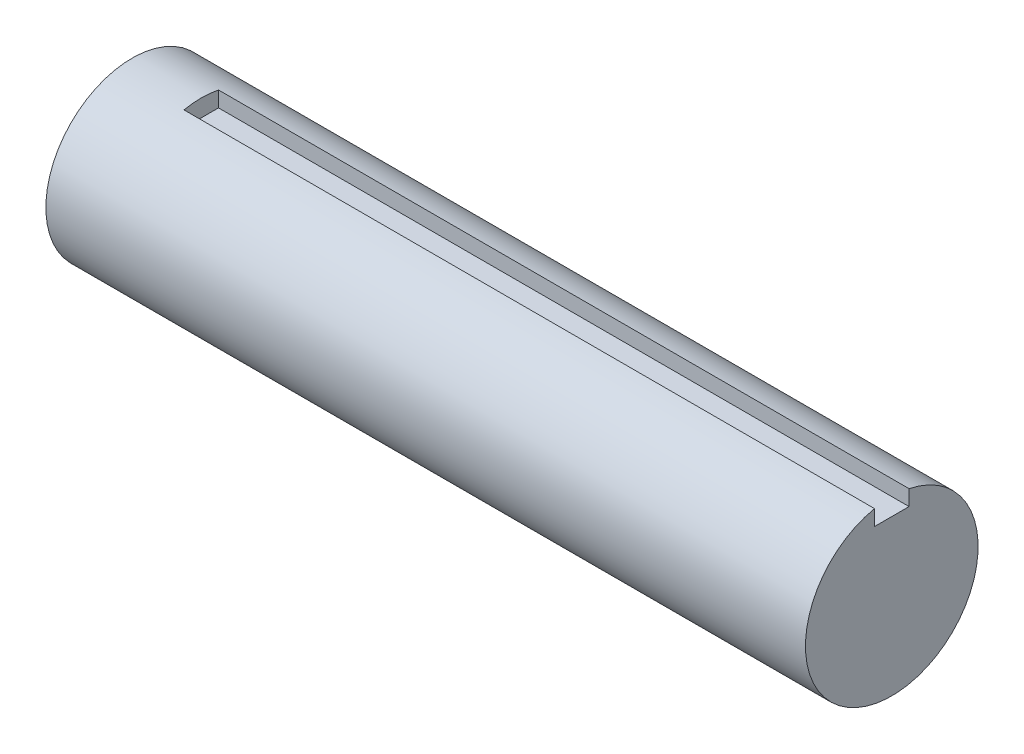
ISO-10303-21;
HEADER;
FILE_DESCRIPTION(('STEP AP214'),'2;1');
FILE_NAME('part.step','',(''),(''),'','','');
FILE_SCHEMA(('AUTOMOTIVE_DESIGN { 1 0 10303 214 1 1 1 1 }'));
ENDSEC;
DATA;
#1=APPLICATION_CONTEXT('core data for automotive mechanical design processes');
#2=APPLICATION_PROTOCOL_DEFINITION('international standard','automotive_design',2000,#1);
#3=PRODUCT_CONTEXT('',#1,'mechanical');
#4=PRODUCT('Part','Part','',(#3));
#5=PRODUCT_RELATED_PRODUCT_CATEGORY('part','',(#4));
#6=PRODUCT_DEFINITION_FORMATION('','',#4);
#7=PRODUCT_DEFINITION_CONTEXT('part definition',#1,'design');
#8=PRODUCT_DEFINITION('design','',#6,#7);
#9=PRODUCT_DEFINITION_SHAPE('','',#8);
#10=(LENGTH_UNIT() NAMED_UNIT(*) SI_UNIT(.MILLI.,.METRE.));
#11=(NAMED_UNIT(*) PLANE_ANGLE_UNIT() SI_UNIT($,.RADIAN.));
#12=(NAMED_UNIT(*) SI_UNIT($,.STERADIAN.) SOLID_ANGLE_UNIT());
#13=UNCERTAINTY_MEASURE_WITH_UNIT(LENGTH_MEASURE(1.E-05),#10,'distance_accuracy_value','');
#14=(GEOMETRIC_REPRESENTATION_CONTEXT(3) GLOBAL_UNCERTAINTY_ASSIGNED_CONTEXT((#13)) GLOBAL_UNIT_ASSIGNED_CONTEXT((#10,
#11,#12)) REPRESENTATION_CONTEXT('',''));
#15=CARTESIAN_POINT('',(0.,0.,0.));
#16=DIRECTION('',(0.,0.,1.));
#17=DIRECTION('',(1.,0.,0.));
#18=AXIS2_PLACEMENT_3D('',#15,#16,#17);
#19=CARTESIAN_POINT('',(335.28,0.,0.));
#20=DIRECTION('',(-1.,0.,0.));
#21=DIRECTION('',(0.,0.,1.));
#22=AXIS2_PLACEMENT_3D('',#19,#20,#21);
#23=CYLINDRICAL_SURFACE('',#22,38.1);
#24=CARTESIAN_POINT('',(30.48,0.,0.));
#25=DIRECTION('',(-1.,0.,0.));
#26=DIRECTION('',(0.,0.,1.));
#27=AXIS2_PLACEMENT_3D('',#24,#25,#26);
#28=CIRCLE('',#27,38.1);
#29=CARTESIAN_POINT('',(30.48,37.3302236800156,7.62));
#30=VERTEX_POINT('',#29);
#31=CARTESIAN_POINT('',(30.48,37.3302236800156,-7.62));
#32=VERTEX_POINT('',#31);
#33=EDGE_CURVE('E11',#30,#32,#28,.T.);
#34=ORIENTED_EDGE('',*,*,#33,.T.);
#35=DIRECTION('',(-1.,0.,0.));
#36=VECTOR('',#35,1.);
#37=CARTESIAN_POINT('',(335.28,37.3302236800156,-7.62));
#38=LINE('',#37,#36);
#39=CARTESIAN_POINT('',(335.28,37.3302236800156,-7.62));
#40=VERTEX_POINT('',#39);
#41=EDGE_CURVE('E55',#32,#40,#38,.F.);
#42=ORIENTED_EDGE('',*,*,#41,.T.);
#43=CARTESIAN_POINT('',(335.28,0.,0.));
#44=DIRECTION('',(1.,0.,0.));
#45=DIRECTION('',(0.,0.,-1.));
#46=AXIS2_PLACEMENT_3D('',#43,#44,#45);
#47=CIRCLE('',#46,38.1);
#48=CARTESIAN_POINT('',(335.28,37.3302236800156,7.62));
#49=VERTEX_POINT('',#48);
#50=EDGE_CURVE('E101',#49,#40,#47,.T.);
#51=ORIENTED_EDGE('',*,*,#50,.F.);
#52=DIRECTION('',(-1.,0.,0.));
#53=VECTOR('',#52,1.);
#54=CARTESIAN_POINT('',(335.28,37.3302236800156,7.62));
#55=LINE('',#54,#53);
#56=EDGE_CURVE('E47',#49,#30,#55,.T.);
#57=ORIENTED_EDGE('',*,*,#56,.T.);
#58=EDGE_LOOP('',(#34,#42,#51,#57));
#59=FACE_BOUND('',#58,.T.);
#60=CARTESIAN_POINT('',(0.,0.,0.));
#61=DIRECTION('',(1.,0.,0.));
#62=DIRECTION('',(0.,0.,-1.));
#63=AXIS2_PLACEMENT_3D('',#60,#61,#62);
#64=CIRCLE('',#63,38.1);
#65=CARTESIAN_POINT('',(0.,0.,-38.1));
#66=VERTEX_POINT('',#65);
#67=EDGE_CURVE('E100',#66,#66,#64,.T.);
#68=ORIENTED_EDGE('',*,*,#67,.T.);
#69=EDGE_LOOP('',(#68));
#70=FACE_BOUND('',#69,.T.);
#71=ADVANCED_FACE('F33',(#59,#70),#23,.T.);
#72=CARTESIAN_POINT('',(335.28,0.,0.));
#73=DIRECTION('',(1.,0.,0.));
#74=DIRECTION('',(0.,0.,-1.));
#75=AXIS2_PLACEMENT_3D('',#72,#73,#74);
#76=PLANE('',#75);
#77=DIRECTION('',(0.,1.,0.));
#78=VECTOR('',#77,1.);
#79=CARTESIAN_POINT('',(335.28,45.72,-7.62));
#80=LINE('',#79,#78);
#81=CARTESIAN_POINT('',(335.28,30.48,-7.62));
#82=VERTEX_POINT('',#81);
#83=EDGE_CURVE('E93',#82,#40,#80,.T.);
#84=ORIENTED_EDGE('',*,*,#83,.F.);
#85=DIRECTION('',(0.,0.,-1.));
#86=VECTOR('',#85,1.);
#87=CARTESIAN_POINT('',(335.28,30.48,-7.62));
#88=LINE('',#87,#86);
#89=CARTESIAN_POINT('',(335.28,30.48,7.62));
#90=VERTEX_POINT('',#89);
#91=EDGE_CURVE('E95',#90,#82,#88,.T.);
#92=ORIENTED_EDGE('',*,*,#91,.F.);
#93=DIRECTION('',(0.,-1.,0.));
#94=VECTOR('',#93,1.);
#95=CARTESIAN_POINT('',(335.28,0.,7.61999999999999));
#96=LINE('',#95,#94);
#97=EDGE_CURVE('E40',#49,#90,#96,.T.);
#98=ORIENTED_EDGE('',*,*,#97,.F.);
#99=ORIENTED_EDGE('',*,*,#50,.T.);
#100=EDGE_LOOP('',(#84,#92,#98,#99));
#101=FACE_BOUND('',#100,.T.);
#102=ADVANCED_FACE('F110',(#101),#76,.T.);
#103=CARTESIAN_POINT('',(0.,0.,0.));
#104=DIRECTION('',(1.,0.,0.));
#105=DIRECTION('',(0.,0.,-1.));
#106=AXIS2_PLACEMENT_3D('',#103,#104,#105);
#107=PLANE('',#106);
#108=ORIENTED_EDGE('',*,*,#67,.F.);
#109=EDGE_LOOP('',(#108));
#110=FACE_BOUND('',#109,.T.);
#111=ADVANCED_FACE('F108',(#110),#107,.F.);
#112=CARTESIAN_POINT('',(30.48,0.,0.));
#113=DIRECTION('',(-1.,0.,0.));
#114=DIRECTION('',(0.,0.,1.));
#115=AXIS2_PLACEMENT_3D('',#112,#113,#114);
#116=PLANE('',#115);
#117=DIRECTION('',(0.,-1.,0.));
#118=VECTOR('',#117,1.);
#119=CARTESIAN_POINT('',(30.48,45.72,7.62));
#120=LINE('',#119,#118);
#121=CARTESIAN_POINT('',(30.48,30.48,7.62));
#122=VERTEX_POINT('',#121);
#123=EDGE_CURVE('E74',#30,#122,#120,.T.);
#124=ORIENTED_EDGE('',*,*,#123,.T.);
#125=DIRECTION('',(0.,0.,-1.));
#126=VECTOR('',#125,1.);
#127=CARTESIAN_POINT('',(30.48,30.48,-7.62));
#128=LINE('',#127,#126);
#129=CARTESIAN_POINT('',(30.48,30.48,-7.62));
#130=VERTEX_POINT('',#129);
#131=EDGE_CURVE('E78',#122,#130,#128,.T.);
#132=ORIENTED_EDGE('',*,*,#131,.T.);
#133=DIRECTION('',(0.,1.,0.));
#134=VECTOR('',#133,1.);
#135=CARTESIAN_POINT('',(30.48,45.72,-7.62));
#136=LINE('',#135,#134);
#137=EDGE_CURVE('E79',#130,#32,#136,.T.);
#138=ORIENTED_EDGE('',*,*,#137,.T.);
#139=ORIENTED_EDGE('',*,*,#33,.F.);
#140=EDGE_LOOP('',(#124,#132,#138,#139));
#141=FACE_BOUND('',#140,.T.);
#142=ADVANCED_FACE('F76',(#141),#116,.F.);
#143=CARTESIAN_POINT('',(30.48,45.72,-7.62));
#144=DIRECTION('',(0.,0.,-1.));
#145=DIRECTION('',(0.,1.,0.));
#146=AXIS2_PLACEMENT_3D('',#143,#144,#145);
#147=PLANE('',#146);
#148=ORIENTED_EDGE('',*,*,#137,.F.);
#149=DIRECTION('',(1.,0.,0.));
#150=VECTOR('',#149,1.);
#151=CARTESIAN_POINT('',(30.48,30.48,-7.62));
#152=LINE('',#151,#150);
#153=EDGE_CURVE('E87',#130,#82,#152,.T.);
#154=ORIENTED_EDGE('',*,*,#153,.T.);
#155=ORIENTED_EDGE('',*,*,#83,.T.);
#156=ORIENTED_EDGE('',*,*,#41,.F.);
#157=EDGE_LOOP('',(#148,#154,#155,#156));
#158=FACE_BOUND('',#157,.T.);
#159=ADVANCED_FACE('F115',(#158),#147,.F.);
#160=CARTESIAN_POINT('',(30.48,45.72,7.62));
#161=DIRECTION('',(0.,0.,1.));
#162=DIRECTION('',(0.,-1.,0.));
#163=AXIS2_PLACEMENT_3D('',#160,#161,#162);
#164=PLANE('',#163);
#165=ORIENTED_EDGE('',*,*,#97,.T.);
#166=DIRECTION('',(1.,0.,0.));
#167=VECTOR('',#166,1.);
#168=CARTESIAN_POINT('',(30.48,30.48,7.62));
#169=LINE('',#168,#167);
#170=EDGE_CURVE('E82',#122,#90,#169,.T.);
#171=ORIENTED_EDGE('',*,*,#170,.F.);
#172=ORIENTED_EDGE('',*,*,#123,.F.);
#173=ORIENTED_EDGE('',*,*,#56,.F.);
#174=EDGE_LOOP('',(#165,#171,#172,#173));
#175=FACE_BOUND('',#174,.T.);
#176=ADVANCED_FACE('F83',(#175),#164,.F.);
#177=CARTESIAN_POINT('',(30.48,30.48,-7.62));
#178=DIRECTION('',(0.,-1.,0.));
#179=DIRECTION('',(0.,0.,-1.));
#180=AXIS2_PLACEMENT_3D('',#177,#178,#179);
#181=PLANE('',#180);
#182=ORIENTED_EDGE('',*,*,#91,.T.);
#183=ORIENTED_EDGE('',*,*,#153,.F.);
#184=ORIENTED_EDGE('',*,*,#131,.F.);
#185=ORIENTED_EDGE('',*,*,#170,.T.);
#186=EDGE_LOOP('',(#182,#183,#184,#185));
#187=FACE_BOUND('',#186,.T.);
#188=ADVANCED_FACE('F89',(#187),#181,.F.);
#189=CLOSED_SHELL('',(#71,#102,#111,#142,#159,#176,#188));
#190=MANIFOLD_SOLID_BREP('B2',#189);
#191=ADVANCED_BREP_SHAPE_REPRESENTATION('',(#18,#190),#14);
#192=SHAPE_DEFINITION_REPRESENTATION(#9,#191);
ENDSEC;
END-ISO-10303-21;
